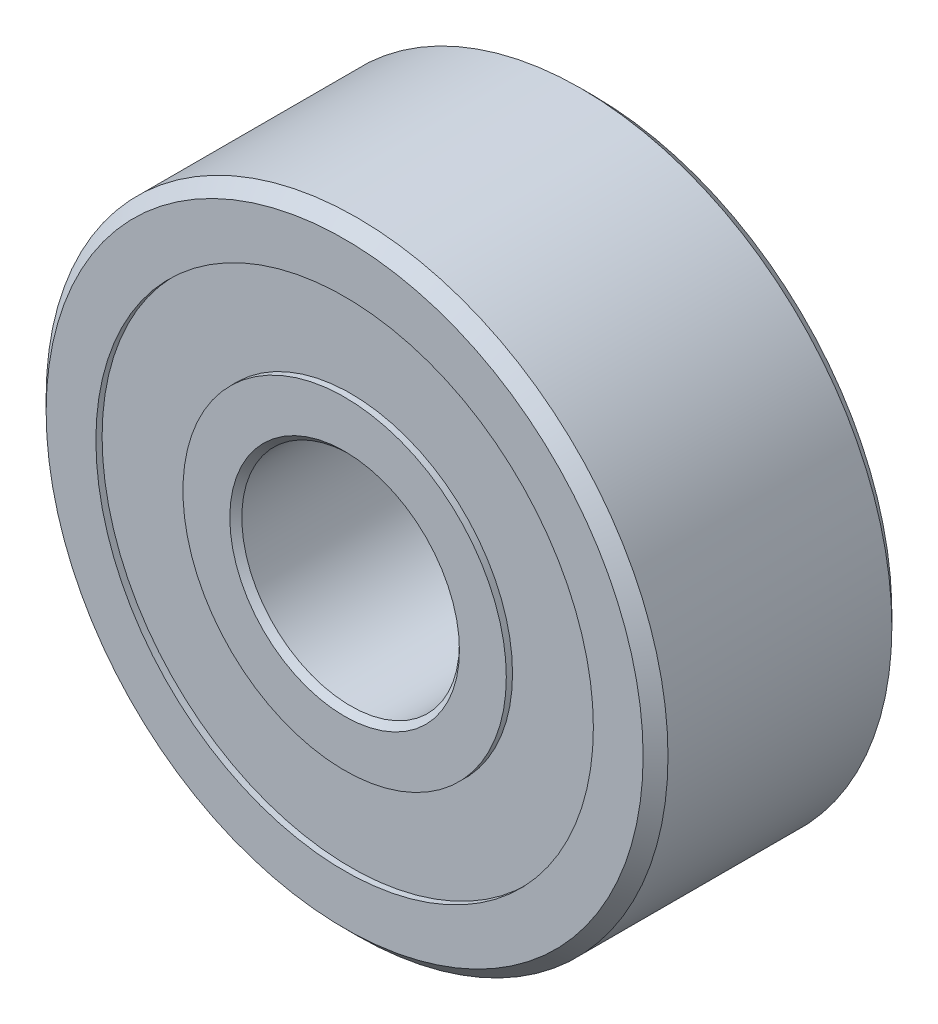
ISO-10303-21;
HEADER;
FILE_DESCRIPTION(('STEP AP214'),'2;1');
FILE_NAME('part.step','',(''),(''),'','','');
FILE_SCHEMA(('AUTOMOTIVE_DESIGN { 1 0 10303 214 1 1 1 1 }'));
ENDSEC;
DATA;
#1=APPLICATION_CONTEXT('core data for automotive mechanical design processes');
#2=APPLICATION_PROTOCOL_DEFINITION('international standard','automotive_design',2000,#1);
#3=PRODUCT_CONTEXT('',#1,'mechanical');
#4=PRODUCT('Part','Part','',(#3));
#5=PRODUCT_RELATED_PRODUCT_CATEGORY('part','',(#4));
#6=PRODUCT_DEFINITION_FORMATION('','',#4);
#7=PRODUCT_DEFINITION_CONTEXT('part definition',#1,'design');
#8=PRODUCT_DEFINITION('design','',#6,#7);
#9=PRODUCT_DEFINITION_SHAPE('','',#8);
#10=(LENGTH_UNIT() NAMED_UNIT(*) SI_UNIT(.MILLI.,.METRE.));
#11=(NAMED_UNIT(*) PLANE_ANGLE_UNIT() SI_UNIT($,.RADIAN.));
#12=(NAMED_UNIT(*) SI_UNIT($,.STERADIAN.) SOLID_ANGLE_UNIT());
#13=UNCERTAINTY_MEASURE_WITH_UNIT(LENGTH_MEASURE(1.E-05),#10,'distance_accuracy_value','');
#14=(GEOMETRIC_REPRESENTATION_CONTEXT(3) GLOBAL_UNCERTAINTY_ASSIGNED_CONTEXT((#13)) GLOBAL_UNIT_ASSIGNED_CONTEXT((#10,
#11,#12)) REPRESENTATION_CONTEXT('',''));
#15=CARTESIAN_POINT('',(0.,0.,0.));
#16=DIRECTION('',(0.,0.,1.));
#17=DIRECTION('',(1.,0.,0.));
#18=AXIS2_PLACEMENT_3D('',#15,#16,#17);
#19=CARTESIAN_POINT('',(0.,3.76373626373626,1.9));
#20=DIRECTION('',(0.,0.,-1.));
#21=DIRECTION('',(-1.,0.,0.));
#22=AXIS2_PLACEMENT_3D('',#19,#20,#21);
#23=PLANE('',#22);
#24=CARTESIAN_POINT('',(0.,0.,1.9));
#25=DIRECTION('',(0.,0.,1.));
#26=DIRECTION('',(1.,0.,0.));
#27=AXIS2_PLACEMENT_3D('',#24,#25,#26);
#28=CIRCLE('',#27,2.6);
#29=CARTESIAN_POINT('',(2.6,0.,1.9));
#30=VERTEX_POINT('',#29);
#31=EDGE_CURVE('P0_E26',#30,#30,#28,.F.);
#32=ORIENTED_EDGE('',*,*,#31,.T.);
#33=EDGE_LOOP('',(#32));
#34=FACE_BOUND('',#33,.T.);
#35=CARTESIAN_POINT('',(0.,0.,1.9));
#36=DIRECTION('',(0.,0.,1.));
#37=DIRECTION('',(1.,0.,0.));
#38=AXIS2_PLACEMENT_3D('',#35,#36,#37);
#39=CIRCLE('',#38,4.);
#40=CARTESIAN_POINT('',(4.,0.,1.9));
#41=VERTEX_POINT('',#40);
#42=EDGE_CURVE('P0_E17',#41,#41,#39,.F.);
#43=ORIENTED_EDGE('',*,*,#42,.F.);
#44=EDGE_LOOP('',(#43));
#45=FACE_BOUND('',#44,.T.);
#46=ADVANCED_FACE('P0_F14',(#34,#45),#23,.F.);
#47=CARTESIAN_POINT('',(0.,0.,2.));
#48=DIRECTION('',(0.,0.,1.));
#49=DIRECTION('',(1.,0.,0.));
#50=AXIS2_PLACEMENT_3D('',#47,#48,#49);
#51=CYLINDRICAL_SURFACE('',#50,4.);
#52=CARTESIAN_POINT('',(0.,0.,0.927189448602435));
#53=DIRECTION('',(0.,0.,1.));
#54=DIRECTION('',(1.,0.,0.));
#55=AXIS2_PLACEMENT_3D('',#52,#53,#54);
#56=CIRCLE('',#55,4.);
#57=CARTESIAN_POINT('',(4.,0.,0.927189448602435));
#58=VERTEX_POINT('',#57);
#59=EDGE_CURVE('P0_E21',#58,#58,#56,.T.);
#60=ORIENTED_EDGE('',*,*,#59,.T.);
#61=EDGE_LOOP('',(#60));
#62=FACE_BOUND('',#61,.T.);
#63=ORIENTED_EDGE('',*,*,#42,.T.);
#64=EDGE_LOOP('',(#63));
#65=FACE_BOUND('',#64,.T.);
#66=ADVANCED_FACE('P0_F34',(#62,#65),#51,.T.);
#67=CARTESIAN_POINT('',(0.,0.,2.));
#68=DIRECTION('',(0.,0.,1.));
#69=DIRECTION('',(1.,0.,0.));
#70=AXIS2_PLACEMENT_3D('',#67,#68,#69);
#71=CYLINDRICAL_SURFACE('',#70,2.6);
#72=ORIENTED_EDGE('',*,*,#31,.F.);
#73=EDGE_LOOP('',(#72));
#74=FACE_BOUND('',#73,.T.);
#75=CARTESIAN_POINT('',(0.,0.,0.927189448602435));
#76=DIRECTION('',(0.,0.,1.));
#77=DIRECTION('',(1.,0.,0.));
#78=AXIS2_PLACEMENT_3D('',#75,#76,#77);
#79=CIRCLE('',#78,2.6);
#80=CARTESIAN_POINT('',(2.6,0.,0.927189448602435));
#81=VERTEX_POINT('',#80);
#82=EDGE_CURVE('P0_E10',#81,#81,#79,.F.);
#83=ORIENTED_EDGE('',*,*,#82,.T.);
#84=EDGE_LOOP('',(#83));
#85=FACE_BOUND('',#84,.T.);
#86=ADVANCED_FACE('P0_F41',(#74,#85),#71,.F.);
#87=CARTESIAN_POINT('',(0.,3.76373626373626,0.927189448602435));
#88=DIRECTION('',(0.,0.,1.));
#89=DIRECTION('',(1.,0.,0.));
#90=AXIS2_PLACEMENT_3D('',#87,#88,#89);
#91=PLANE('',#90);
#92=ORIENTED_EDGE('',*,*,#82,.F.);
#93=EDGE_LOOP('',(#92));
#94=FACE_BOUND('',#93,.T.);
#95=ORIENTED_EDGE('',*,*,#59,.F.);
#96=EDGE_LOOP('',(#95));
#97=FACE_BOUND('',#96,.T.);
#98=ADVANCED_FACE('P0_F43',(#94,#97),#91,.F.);
#99=CLOSED_SHELL('',(#46,#66,#86,#98));
#100=MANIFOLD_SOLID_BREP('P0_B1',#99);
#101=CARTESIAN_POINT('',(0.,3.76373626373626,-0.927189448602435));
#102=DIRECTION('',(0.,0.,-1.));
#103=DIRECTION('',(-1.,0.,0.));
#104=AXIS2_PLACEMENT_3D('',#101,#102,#103);
#105=PLANE('',#104);
#106=CARTESIAN_POINT('',(0.,0.,-0.927189448602435));
#107=DIRECTION('',(0.,0.,1.));
#108=DIRECTION('',(1.,0.,0.));
#109=AXIS2_PLACEMENT_3D('',#106,#107,#108);
#110=CIRCLE('',#109,2.6);
#111=CARTESIAN_POINT('',(2.6,0.,-0.927189448602435));
#112=VERTEX_POINT('',#111);
#113=EDGE_CURVE('P1_E26',#112,#112,#110,.F.);
#114=ORIENTED_EDGE('',*,*,#113,.T.);
#115=EDGE_LOOP('',(#114));
#116=FACE_BOUND('',#115,.T.);
#117=CARTESIAN_POINT('',(0.,0.,-0.927189448602435));
#118=DIRECTION('',(0.,0.,1.));
#119=DIRECTION('',(1.,0.,0.));
#120=AXIS2_PLACEMENT_3D('',#117,#118,#119);
#121=CIRCLE('',#120,4.);
#122=CARTESIAN_POINT('',(4.,0.,-0.927189448602435));
#123=VERTEX_POINT('',#122);
#124=EDGE_CURVE('P1_E17',#123,#123,#121,.F.);
#125=ORIENTED_EDGE('',*,*,#124,.F.);
#126=EDGE_LOOP('',(#125));
#127=FACE_BOUND('',#126,.T.);
#128=ADVANCED_FACE('P1_F14',(#116,#127),#105,.F.);
#129=CARTESIAN_POINT('',(0.,0.,2.));
#130=DIRECTION('',(0.,0.,1.));
#131=DIRECTION('',(1.,0.,0.));
#132=AXIS2_PLACEMENT_3D('',#129,#130,#131);
#133=CYLINDRICAL_SURFACE('',#132,4.);
#134=CARTESIAN_POINT('',(0.,0.,-1.9));
#135=DIRECTION('',(0.,0.,1.));
#136=DIRECTION('',(1.,0.,0.));
#137=AXIS2_PLACEMENT_3D('',#134,#135,#136);
#138=CIRCLE('',#137,4.);
#139=CARTESIAN_POINT('',(4.,0.,-1.9));
#140=VERTEX_POINT('',#139);
#141=EDGE_CURVE('P1_E21',#140,#140,#138,.T.);
#142=ORIENTED_EDGE('',*,*,#141,.T.);
#143=EDGE_LOOP('',(#142));
#144=FACE_BOUND('',#143,.T.);
#145=ORIENTED_EDGE('',*,*,#124,.T.);
#146=EDGE_LOOP('',(#145));
#147=FACE_BOUND('',#146,.T.);
#148=ADVANCED_FACE('P1_F34',(#144,#147),#133,.T.);
#149=CARTESIAN_POINT('',(0.,0.,2.));
#150=DIRECTION('',(0.,0.,1.));
#151=DIRECTION('',(1.,0.,0.));
#152=AXIS2_PLACEMENT_3D('',#149,#150,#151);
#153=CYLINDRICAL_SURFACE('',#152,2.6);
#154=ORIENTED_EDGE('',*,*,#113,.F.);
#155=EDGE_LOOP('',(#154));
#156=FACE_BOUND('',#155,.T.);
#157=CARTESIAN_POINT('',(0.,0.,-1.9));
#158=DIRECTION('',(0.,0.,1.));
#159=DIRECTION('',(1.,0.,0.));
#160=AXIS2_PLACEMENT_3D('',#157,#158,#159);
#161=CIRCLE('',#160,2.6);
#162=CARTESIAN_POINT('',(2.6,0.,-1.9));
#163=VERTEX_POINT('',#162);
#164=EDGE_CURVE('P1_E10',#163,#163,#161,.F.);
#165=ORIENTED_EDGE('',*,*,#164,.T.);
#166=EDGE_LOOP('',(#165));
#167=FACE_BOUND('',#166,.T.);
#168=ADVANCED_FACE('P1_F41',(#156,#167),#153,.F.);
#169=CARTESIAN_POINT('',(0.,3.76373626373626,-1.9));
#170=DIRECTION('',(0.,0.,1.));
#171=DIRECTION('',(1.,0.,0.));
#172=AXIS2_PLACEMENT_3D('',#169,#170,#171);
#173=PLANE('',#172);
#174=ORIENTED_EDGE('',*,*,#164,.F.);
#175=EDGE_LOOP('',(#174));
#176=FACE_BOUND('',#175,.T.);
#177=ORIENTED_EDGE('',*,*,#141,.F.);
#178=EDGE_LOOP('',(#177));
#179=FACE_BOUND('',#178,.T.);
#180=ADVANCED_FACE('P1_F43',(#176,#179),#173,.F.);
#181=CLOSED_SHELL('',(#128,#148,#168,#180));
#182=MANIFOLD_SOLID_BREP('P1_B1',#181);
#183=CARTESIAN_POINT('',(0.,0.,0.));
#184=DIRECTION('',(0.,0.,1.));
#185=DIRECTION('',(1.,0.,0.));
#186=AXIS2_PLACEMENT_3D('',#183,#184,#185);
#187=TOROIDAL_SURFACE('',#186,3.5,0.927189448602434);
#188=CARTESIAN_POINT('',(0.,0.,-0.222890721205914));
#189=DIRECTION('',(0.,0.,1.));
#190=DIRECTION('',(1.,0.,0.));
#191=AXIS2_PLACEMENT_3D('',#188,#189,#190);
#192=CIRCLE('',#191,2.6);
#193=CARTESIAN_POINT('',(2.6,0.,-0.222890721205914));
#194=VERTEX_POINT('',#193);
#195=EDGE_CURVE('P2_E35',#194,#194,#192,.F.);
#196=ORIENTED_EDGE('',*,*,#195,.F.);
#197=EDGE_LOOP('',(#196));
#198=FACE_BOUND('',#197,.T.);
#199=CARTESIAN_POINT('',(0.,0.,0.22289072120591));
#200=DIRECTION('',(0.,0.,1.));
#201=DIRECTION('',(1.,0.,0.));
#202=AXIS2_PLACEMENT_3D('',#199,#200,#201);
#203=CIRCLE('',#202,2.6);
#204=CARTESIAN_POINT('',(2.6,0.,0.22289072120591));
#205=VERTEX_POINT('',#204);
#206=EDGE_CURVE('P2_E32',#205,#205,#203,.T.);
#207=ORIENTED_EDGE('',*,*,#206,.F.);
#208=EDGE_LOOP('',(#207));
#209=FACE_BOUND('',#208,.T.);
#210=ADVANCED_FACE('P2_F14',(#198,#209),#187,.F.);
#211=CARTESIAN_POINT('',(0.,0.,2.));
#212=DIRECTION('',(0.,0.,1.));
#213=DIRECTION('',(1.,0.,0.));
#214=AXIS2_PLACEMENT_3D('',#211,#212,#213);
#215=CYLINDRICAL_SURFACE('',#214,2.6);
#216=CARTESIAN_POINT('',(0.,0.,-2.));
#217=DIRECTION('',(0.,0.,1.));
#218=DIRECTION('',(1.,0.,0.));
#219=AXIS2_PLACEMENT_3D('',#216,#217,#218);
#220=CIRCLE('',#219,2.6);
#221=CARTESIAN_POINT('',(2.6,0.,-2.));
#222=VERTEX_POINT('',#221);
#223=EDGE_CURVE('P2_E18',#222,#222,#220,.T.);
#224=ORIENTED_EDGE('',*,*,#223,.T.);
#225=EDGE_LOOP('',(#224));
#226=FACE_BOUND('',#225,.T.);
#227=ORIENTED_EDGE('',*,*,#195,.T.);
#228=EDGE_LOOP('',(#227));
#229=FACE_BOUND('',#228,.T.);
#230=ADVANCED_FACE('P2_F50',(#226,#229),#215,.T.);
#231=CARTESIAN_POINT('',(0.,0.,2.));
#232=DIRECTION('',(0.,0.,1.));
#233=DIRECTION('',(1.,0.,0.));
#234=AXIS2_PLACEMENT_3D('',#231,#232,#233);
#235=CYLINDRICAL_SURFACE('',#234,2.6);
#236=ORIENTED_EDGE('',*,*,#206,.T.);
#237=EDGE_LOOP('',(#236));
#238=FACE_BOUND('',#237,.T.);
#239=CARTESIAN_POINT('',(0.,0.,2.));
#240=DIRECTION('',(0.,0.,1.));
#241=DIRECTION('',(1.,0.,0.));
#242=AXIS2_PLACEMENT_3D('',#239,#240,#241);
#243=CIRCLE('',#242,2.6);
#244=CARTESIAN_POINT('',(2.6,0.,2.));
#245=VERTEX_POINT('',#244);
#246=EDGE_CURVE('P2_E43',#245,#245,#243,.F.);
#247=ORIENTED_EDGE('',*,*,#246,.T.);
#248=EDGE_LOOP('',(#247));
#249=FACE_BOUND('',#248,.T.);
#250=ADVANCED_FACE('P2_F56',(#238,#249),#235,.T.);
#251=CARTESIAN_POINT('',(0.,2.2,-2.));
#252=DIRECTION('',(0.,0.,1.));
#253=DIRECTION('',(1.,0.,0.));
#254=AXIS2_PLACEMENT_3D('',#251,#252,#253);
#255=PLANE('',#254);
#256=CARTESIAN_POINT('',(0.,0.,-1.99999999995271));
#257=DIRECTION('',(0.,0.,-1.));
#258=DIRECTION('',(-1.,0.,0.));
#259=AXIS2_PLACEMENT_3D('',#256,#257,#258);
#260=CIRCLE('',#259,1.84644660936328);
#261=CARTESIAN_POINT('',(-1.84644660936328,0.,-1.99999999995271));
#262=VERTEX_POINT('',#261);
#263=EDGE_CURVE('P2_E41',#262,#262,#260,.F.);
#264=ORIENTED_EDGE('',*,*,#263,.T.);
#265=EDGE_LOOP('',(#264));
#266=FACE_BOUND('',#265,.T.);
#267=ORIENTED_EDGE('',*,*,#223,.F.);
#268=EDGE_LOOP('',(#267));
#269=FACE_BOUND('',#268,.T.);
#270=ADVANCED_FACE('P2_F53',(#266,#269),#255,.F.);
#271=CARTESIAN_POINT('',(0.,3.23626373626374,2.));
#272=DIRECTION('',(0.,0.,-1.));
#273=DIRECTION('',(-1.,0.,0.));
#274=AXIS2_PLACEMENT_3D('',#271,#272,#273);
#275=PLANE('',#274);
#276=CARTESIAN_POINT('',(0.,0.,2.00000000006639));
#277=DIRECTION('',(0.,0.,1.));
#278=DIRECTION('',(1.,0.,0.));
#279=AXIS2_PLACEMENT_3D('',#276,#277,#278);
#280=CIRCLE('',#279,1.84644660942013);
#281=CARTESIAN_POINT('',(1.84644660942013,0.,2.00000000006639));
#282=VERTEX_POINT('',#281);
#283=EDGE_CURVE('P2_E27',#282,#282,#280,.F.);
#284=ORIENTED_EDGE('',*,*,#283,.T.);
#285=EDGE_LOOP('',(#284));
#286=FACE_BOUND('',#285,.T.);
#287=ORIENTED_EDGE('',*,*,#246,.F.);
#288=EDGE_LOOP('',(#287));
#289=FACE_BOUND('',#288,.T.);
#290=ADVANCED_FACE('P2_F55',(#286,#289),#275,.F.);
#291=CARTESIAN_POINT('',(0.,0.,-1.99999999995271));
#292=DIRECTION('',(0.,0.,-1.));
#293=DIRECTION('',(-1.,0.,0.));
#294=AXIS2_PLACEMENT_3D('',#291,#292,#293);
#295=CONICAL_SURFACE('',#294,1.84644660936328,0.785398163397448);
#296=ORIENTED_EDGE('',*,*,#263,.F.);
#297=EDGE_LOOP('',(#296));
#298=FACE_BOUND('',#297,.T.);
#299=CARTESIAN_POINT('',(0.,0.,-1.90355339059327));
#300=DIRECTION('',(0.,0.,1.));
#301=DIRECTION('',(1.,0.,0.));
#302=AXIS2_PLACEMENT_3D('',#299,#300,#301);
#303=CIRCLE('',#302,1.75);
#304=CARTESIAN_POINT('',(1.75,0.,-1.90355339059327));
#305=VERTEX_POINT('',#304);
#306=EDGE_CURVE('P2_E22',#305,#305,#303,.T.);
#307=ORIENTED_EDGE('',*,*,#306,.T.);
#308=EDGE_LOOP('',(#307));
#309=FACE_BOUND('',#308,.T.);
#310=ADVANCED_FACE('P2_F64',(#298,#309),#295,.F.);
#311=CARTESIAN_POINT('',(0.,0.,1.99999999995271));
#312=DIRECTION('',(0.,0.,1.));
#313=DIRECTION('',(1.,0.,0.));
#314=AXIS2_PLACEMENT_3D('',#311,#312,#313);
#315=CONICAL_SURFACE('',#314,1.84644660930644,0.785398163397448);
#316=ORIENTED_EDGE('',*,*,#283,.F.);
#317=EDGE_LOOP('',(#316));
#318=FACE_BOUND('',#317,.T.);
#319=CARTESIAN_POINT('',(0.,0.,1.90355339059328));
#320=DIRECTION('',(0.,0.,1.));
#321=DIRECTION('',(1.,0.,0.));
#322=AXIS2_PLACEMENT_3D('',#319,#320,#321);
#323=CIRCLE('',#322,1.75);
#324=CARTESIAN_POINT('',(1.75,0.,1.90355339059328));
#325=VERTEX_POINT('',#324);
#326=EDGE_CURVE('P2_E10',#325,#325,#323,.F.);
#327=ORIENTED_EDGE('',*,*,#326,.T.);
#328=EDGE_LOOP('',(#327));
#329=FACE_BOUND('',#328,.T.);
#330=ADVANCED_FACE('P2_F71',(#318,#329),#315,.F.);
#331=CARTESIAN_POINT('',(0.,0.,2.));
#332=DIRECTION('',(0.,0.,1.));
#333=DIRECTION('',(1.,0.,0.));
#334=AXIS2_PLACEMENT_3D('',#331,#332,#333);
#335=CYLINDRICAL_SURFACE('',#334,1.75);
#336=ORIENTED_EDGE('',*,*,#326,.F.);
#337=EDGE_LOOP('',(#336));
#338=FACE_BOUND('',#337,.T.);
#339=ORIENTED_EDGE('',*,*,#306,.F.);
#340=EDGE_LOOP('',(#339));
#341=FACE_BOUND('',#340,.T.);
#342=ADVANCED_FACE('P2_F69',(#338,#341),#335,.F.);
#343=CLOSED_SHELL('',(#210,#230,#250,#270,#290,#310,#330,#342));
#344=MANIFOLD_SOLID_BREP('P2_B1',#343);
#345=CARTESIAN_POINT('',(0.,0.,0.));
#346=DIRECTION('',(0.,0.,1.));
#347=DIRECTION('',(1.,0.,0.));
#348=AXIS2_PLACEMENT_3D('',#345,#346,#347);
#349=TOROIDAL_SURFACE('',#348,3.5,0.927189448602435);
#350=CARTESIAN_POINT('',(0.,0.,0.78082025690916));
#351=DIRECTION('',(0.,0.,1.));
#352=DIRECTION('',(1.,0.,0.));
#353=AXIS2_PLACEMENT_3D('',#350,#351,#352);
#354=CIRCLE('',#353,4.);
#355=CARTESIAN_POINT('',(4.,0.,0.78082025690916));
#356=VERTEX_POINT('',#355);
#357=EDGE_CURVE('P3_E37',#356,#356,#354,.T.);
#358=ORIENTED_EDGE('',*,*,#357,.T.);
#359=EDGE_LOOP('',(#358));
#360=FACE_BOUND('',#359,.T.);
#361=CARTESIAN_POINT('',(0.,0.,-0.780820256909161));
#362=DIRECTION('',(0.,0.,1.));
#363=DIRECTION('',(1.,0.,0.));
#364=AXIS2_PLACEMENT_3D('',#361,#362,#363);
#365=CIRCLE('',#364,4.);
#366=CARTESIAN_POINT('',(4.,0.,-0.780820256909161));
#367=VERTEX_POINT('',#366);
#368=EDGE_CURVE('P3_E34',#367,#367,#365,.F.);
#369=ORIENTED_EDGE('',*,*,#368,.T.);
#370=EDGE_LOOP('',(#369));
#371=FACE_BOUND('',#370,.T.);
#372=ADVANCED_FACE('P3_F14',(#360,#371),#349,.F.);
#373=CARTESIAN_POINT('',(0.,0.,2.));
#374=DIRECTION('',(0.,0.,1.));
#375=DIRECTION('',(1.,0.,0.));
#376=AXIS2_PLACEMENT_3D('',#373,#374,#375);
#377=CYLINDRICAL_SURFACE('',#376,4.);
#378=CARTESIAN_POINT('',(0.,0.,2.));
#379=DIRECTION('',(0.,0.,1.));
#380=DIRECTION('',(1.,0.,0.));
#381=AXIS2_PLACEMENT_3D('',#378,#379,#380);
#382=CIRCLE('',#381,4.);
#383=CARTESIAN_POINT('',(4.,0.,2.));
#384=VERTEX_POINT('',#383);
#385=EDGE_CURVE('P3_E18',#384,#384,#382,.T.);
#386=ORIENTED_EDGE('',*,*,#385,.T.);
#387=EDGE_LOOP('',(#386));
#388=FACE_BOUND('',#387,.T.);
#389=ORIENTED_EDGE('',*,*,#357,.F.);
#390=EDGE_LOOP('',(#389));
#391=FACE_BOUND('',#390,.T.);
#392=ADVANCED_FACE('P3_F52',(#388,#391),#377,.F.);
#393=CARTESIAN_POINT('',(0.,0.,2.));
#394=DIRECTION('',(0.,0.,1.));
#395=DIRECTION('',(1.,0.,0.));
#396=AXIS2_PLACEMENT_3D('',#393,#394,#395);
#397=CYLINDRICAL_SURFACE('',#396,4.);
#398=ORIENTED_EDGE('',*,*,#368,.F.);
#399=EDGE_LOOP('',(#398));
#400=FACE_BOUND('',#399,.T.);
#401=CARTESIAN_POINT('',(0.,0.,-2.));
#402=DIRECTION('',(0.,0.,1.));
#403=DIRECTION('',(1.,0.,0.));
#404=AXIS2_PLACEMENT_3D('',#401,#402,#403);
#405=CIRCLE('',#404,4.);
#406=CARTESIAN_POINT('',(4.,0.,-2.));
#407=VERTEX_POINT('',#406);
#408=EDGE_CURVE('P3_E45',#407,#407,#405,.F.);
#409=ORIENTED_EDGE('',*,*,#408,.T.);
#410=EDGE_LOOP('',(#409));
#411=FACE_BOUND('',#410,.T.);
#412=ADVANCED_FACE('P3_F59',(#400,#411),#397,.F.);
#413=CARTESIAN_POINT('',(0.,4.8,2.));
#414=DIRECTION('',(0.,0.,-1.));
#415=DIRECTION('',(-1.,0.,0.));
#416=AXIS2_PLACEMENT_3D('',#413,#414,#415);
#417=PLANE('',#416);
#418=ORIENTED_EDGE('',*,*,#385,.F.);
#419=EDGE_LOOP('',(#418));
#420=FACE_BOUND('',#419,.T.);
#421=CARTESIAN_POINT('',(0.,0.,2.00000000000955));
#422=DIRECTION('',(0.,0.,-1.));
#423=DIRECTION('',(-1.,0.,0.));
#424=AXIS2_PLACEMENT_3D('',#421,#422,#423);
#425=CIRCLE('',#424,4.79999999998881);
#426=CARTESIAN_POINT('',(-4.79999999998881,0.,2.00000000000955));
#427=VERTEX_POINT('',#426);
#428=EDGE_CURVE('P3_E43',#427,#427,#425,.T.);
#429=ORIENTED_EDGE('',*,*,#428,.F.);
#430=EDGE_LOOP('',(#429));
#431=FACE_BOUND('',#430,.T.);
#432=ADVANCED_FACE('P3_F55',(#420,#431),#417,.F.);
#433=CARTESIAN_POINT('',(0.,4.8,-2.));
#434=DIRECTION('',(0.,0.,1.));
#435=DIRECTION('',(1.,0.,0.));
#436=AXIS2_PLACEMENT_3D('',#433,#434,#435);
#437=PLANE('',#436);
#438=ORIENTED_EDGE('',*,*,#408,.F.);
#439=EDGE_LOOP('',(#438));
#440=FACE_BOUND('',#439,.T.);
#441=CARTESIAN_POINT('',(0.,0.,-2.00000000000955));
#442=DIRECTION('',(0.,0.,1.));
#443=DIRECTION('',(0.,-1.,0.));
#444=AXIS2_PLACEMENT_3D('',#441,#442,#443);
#445=CIRCLE('',#444,4.79999999998881);
#446=CARTESIAN_POINT('',(0.,-4.79999999998881,-2.00000000000955));
#447=VERTEX_POINT('',#446);
#448=EDGE_CURVE('P3_E27',#447,#447,#445,.T.);
#449=ORIENTED_EDGE('',*,*,#448,.F.);
#450=EDGE_LOOP('',(#449));
#451=FACE_BOUND('',#450,.T.);
#452=ADVANCED_FACE('P3_F58',(#440,#451),#437,.F.);
#453=CARTESIAN_POINT('',(0.,0.,1.80000000000291));
#454=DIRECTION('',(0.,0.,-1.));
#455=DIRECTION('',(-1.,0.,0.));
#456=AXIS2_PLACEMENT_3D('',#453,#454,#455);
#457=CONICAL_SURFACE('',#456,5.0000000000523,0.785398163539557);
#458=ORIENTED_EDGE('',*,*,#428,.T.);
#459=EDGE_LOOP('',(#458));
#460=FACE_BOUND('',#459,.T.);
#461=CARTESIAN_POINT('',(0.,0.,1.8));
#462=DIRECTION('',(0.,0.,1.));
#463=DIRECTION('',(1.,0.,0.));
#464=AXIS2_PLACEMENT_3D('',#461,#462,#463);
#465=CIRCLE('',#464,5.);
#466=CARTESIAN_POINT('',(5.,0.,1.8));
#467=VERTEX_POINT('',#466);
#468=EDGE_CURVE('P3_E22',#467,#467,#465,.F.);
#469=ORIENTED_EDGE('',*,*,#468,.F.);
#470=EDGE_LOOP('',(#469));
#471=FACE_BOUND('',#470,.T.);
#472=ADVANCED_FACE('P3_F63',(#460,#471),#457,.T.);
#473=CARTESIAN_POINT('',(0.,0.,-1.79999999994607));
#474=DIRECTION('',(0.,0.,1.));
#475=DIRECTION('',(0.,-1.,0.));
#476=AXIS2_PLACEMENT_3D('',#473,#474,#475);
#477=CONICAL_SURFACE('',#476,4.99999999999545,0.78539816325534);
#478=ORIENTED_EDGE('',*,*,#448,.T.);
#479=EDGE_LOOP('',(#478));
#480=FACE_BOUND('',#479,.T.);
#481=CARTESIAN_POINT('',(0.,0.,-1.8));
#482=DIRECTION('',(0.,0.,1.));
#483=DIRECTION('',(1.,0.,0.));
#484=AXIS2_PLACEMENT_3D('',#481,#482,#483);
#485=CIRCLE('',#484,5.);
#486=CARTESIAN_POINT('',(5.,0.,-1.8));
#487=VERTEX_POINT('',#486);
#488=EDGE_CURVE('P3_E10',#487,#487,#485,.T.);
#489=ORIENTED_EDGE('',*,*,#488,.F.);
#490=EDGE_LOOP('',(#489));
#491=FACE_BOUND('',#490,.T.);
#492=ADVANCED_FACE('P3_F66',(#480,#491),#477,.T.);
#493=CARTESIAN_POINT('',(0.,0.,2.));
#494=DIRECTION('',(0.,0.,1.));
#495=DIRECTION('',(1.,0.,0.));
#496=AXIS2_PLACEMENT_3D('',#493,#494,#495);
#497=CYLINDRICAL_SURFACE('',#496,5.);
#498=ORIENTED_EDGE('',*,*,#488,.T.);
#499=EDGE_LOOP('',(#498));
#500=FACE_BOUND('',#499,.T.);
#501=ORIENTED_EDGE('',*,*,#468,.T.);
#502=EDGE_LOOP('',(#501));
#503=FACE_BOUND('',#502,.T.);
#504=ADVANCED_FACE('P3_F70',(#500,#503),#497,.T.);
#505=CLOSED_SHELL('',(#372,#392,#412,#432,#452,#472,#492,#504));
#506=MANIFOLD_SOLID_BREP('P3_B1',#505);
#507=ADVANCED_BREP_SHAPE_REPRESENTATION('',(#18,#100,#182,#344,#506),#14);
#508=SHAPE_DEFINITION_REPRESENTATION(#9,#507);
ENDSEC;
END-ISO-10303-21;
